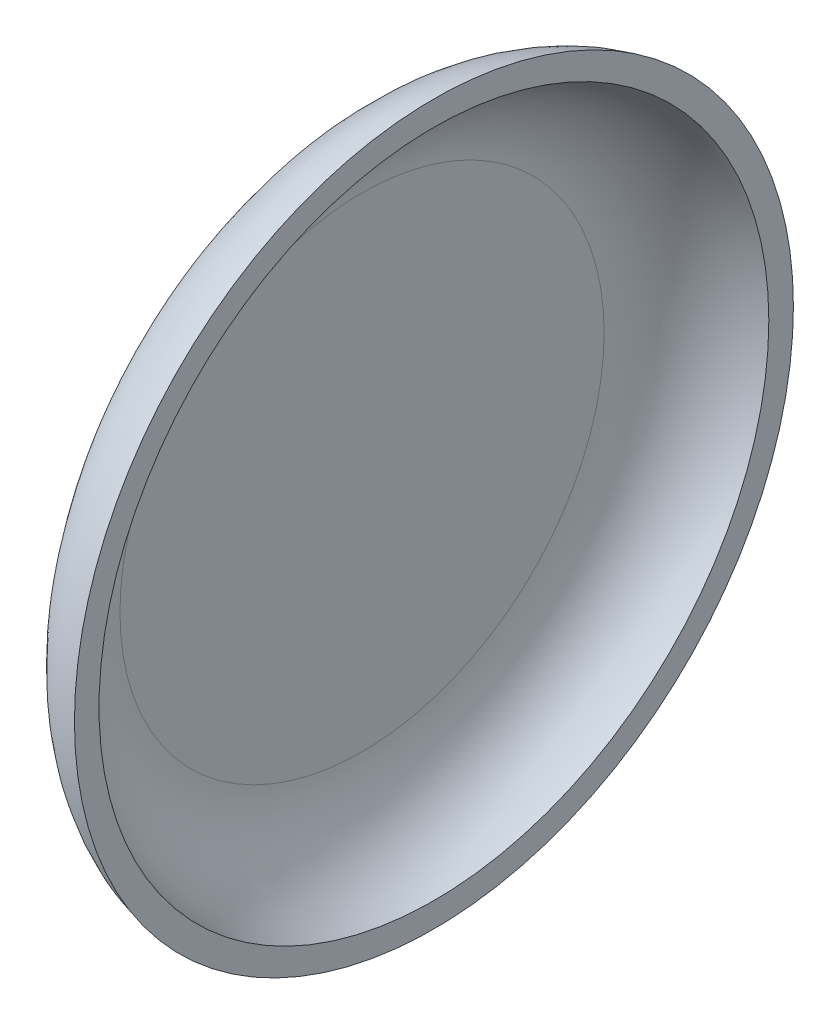
ISO-10303-21;
HEADER;
FILE_DESCRIPTION(('STEP AP214'),'2;1');
FILE_NAME('part.step','',(''),(''),'','','');
FILE_SCHEMA(('AUTOMOTIVE_DESIGN { 1 0 10303 214 1 1 1 1 }'));
ENDSEC;
DATA;
#1=APPLICATION_CONTEXT('core data for automotive mechanical design processes');
#2=APPLICATION_PROTOCOL_DEFINITION('international standard','automotive_design',2000,#1);
#3=PRODUCT_CONTEXT('',#1,'mechanical');
#4=PRODUCT('Part','Part','',(#3));
#5=PRODUCT_RELATED_PRODUCT_CATEGORY('part','',(#4));
#6=PRODUCT_DEFINITION_FORMATION('','',#4);
#7=PRODUCT_DEFINITION_CONTEXT('part definition',#1,'design');
#8=PRODUCT_DEFINITION('design','',#6,#7);
#9=PRODUCT_DEFINITION_SHAPE('','',#8);
#10=(LENGTH_UNIT() NAMED_UNIT(*) SI_UNIT(.MILLI.,.METRE.));
#11=(NAMED_UNIT(*) PLANE_ANGLE_UNIT() SI_UNIT($,.RADIAN.));
#12=(NAMED_UNIT(*) SI_UNIT($,.STERADIAN.) SOLID_ANGLE_UNIT());
#13=UNCERTAINTY_MEASURE_WITH_UNIT(LENGTH_MEASURE(1.E-05),#10,'distance_accuracy_value','');
#14=(GEOMETRIC_REPRESENTATION_CONTEXT(3) GLOBAL_UNCERTAINTY_ASSIGNED_CONTEXT((#13)) GLOBAL_UNIT_ASSIGNED_CONTEXT((#10,
#11,#12)) REPRESENTATION_CONTEXT('',''));
#15=CARTESIAN_POINT('',(0.,0.,0.));
#16=DIRECTION('',(0.,0.,1.));
#17=DIRECTION('',(1.,0.,0.));
#18=AXIS2_PLACEMENT_3D('',#15,#16,#17);
#19=CARTESIAN_POINT('',(-4.,0.,0.));
#20=DIRECTION('',(-1.,0.,0.));
#21=DIRECTION('',(0.,0.,1.));
#22=AXIS2_PLACEMENT_3D('',#19,#20,#21);
#23=PLANE('',#22);
#24=CARTESIAN_POINT('',(-4.,0.,0.));
#25=DIRECTION('',(1.,0.,0.));
#26=DIRECTION('',(0.,0.,-1.));
#27=AXIS2_PLACEMENT_3D('',#24,#25,#26);
#28=CIRCLE('',#27,10.1010205144336);
#29=CARTESIAN_POINT('',(-4.,0.,-10.1010205144336));
#30=VERTEX_POINT('',#29);
#31=EDGE_CURVE('E10',#30,#30,#28,.T.);
#32=ORIENTED_EDGE('',*,*,#31,.F.);
#33=EDGE_LOOP('',(#32));
#34=FACE_BOUND('',#33,.T.);
#35=ADVANCED_FACE('F37',(#34),#23,.T.);
#36=CARTESIAN_POINT('',(1.,0.,0.));
#37=DIRECTION('',(1.,0.,0.));
#38=DIRECTION('',(0.,0.,-1.));
#39=AXIS2_PLACEMENT_3D('',#36,#37,#38);
#40=TOROIDAL_SURFACE('',#39,10.1010205144336,5.);
#41=ORIENTED_EDGE('',*,*,#31,.T.);
#42=EDGE_LOOP('',(#41));
#43=FACE_BOUND('',#42,.T.);
#44=CARTESIAN_POINT('',(0.,0.,0.));
#45=DIRECTION('',(1.,0.,0.));
#46=DIRECTION('',(0.,0.,-1.));
#47=AXIS2_PLACEMENT_3D('',#44,#45,#46);
#48=CIRCLE('',#47,15.);
#49=CARTESIAN_POINT('',(0.,0.,-15.));
#50=VERTEX_POINT('',#49);
#51=EDGE_CURVE('E43',#50,#50,#48,.T.);
#52=ORIENTED_EDGE('',*,*,#51,.F.);
#53=EDGE_LOOP('',(#52));
#54=FACE_BOUND('',#53,.T.);
#55=ADVANCED_FACE('F69',(#43,#54),#40,.T.);
#56=CARTESIAN_POINT('',(0.,15.,0.));
#57=DIRECTION('',(1.,0.,0.));
#58=DIRECTION('',(0.,0.,-1.));
#59=AXIS2_PLACEMENT_3D('',#56,#57,#58);
#60=PLANE('',#59);
#61=ORIENTED_EDGE('',*,*,#51,.T.);
#62=EDGE_LOOP('',(#61));
#63=FACE_BOUND('',#62,.T.);
#64=CARTESIAN_POINT('',(0.,0.,0.));
#65=DIRECTION('',(1.,0.,0.));
#66=DIRECTION('',(0.,0.,-1.));
#67=AXIS2_PLACEMENT_3D('',#64,#65,#66);
#68=CIRCLE('',#67,13.9740038606411);
#69=CARTESIAN_POINT('',(0.,0.,-13.9740038606411));
#70=VERTEX_POINT('',#69);
#71=EDGE_CURVE('E47',#70,#70,#68,.T.);
#72=ORIENTED_EDGE('',*,*,#71,.F.);
#73=EDGE_LOOP('',(#72));
#74=FACE_BOUND('',#73,.T.);
#75=ADVANCED_FACE('F61',(#63,#74),#60,.T.);
#76=CARTESIAN_POINT('',(1.,0.,0.));
#77=DIRECTION('',(1.,0.,0.));
#78=DIRECTION('',(0.,0.,-1.));
#79=AXIS2_PLACEMENT_3D('',#76,#77,#78);
#80=TOROIDAL_SURFACE('',#79,10.1010205144336,4.);
#81=ORIENTED_EDGE('',*,*,#71,.T.);
#82=EDGE_LOOP('',(#81));
#83=FACE_BOUND('',#82,.T.);
#84=CARTESIAN_POINT('',(-3.,0.,0.));
#85=DIRECTION('',(1.,0.,0.));
#86=DIRECTION('',(0.,0.,-1.));
#87=AXIS2_PLACEMENT_3D('',#84,#85,#86);
#88=CIRCLE('',#87,10.1010205144336);
#89=CARTESIAN_POINT('',(-3.,0.,-10.1010205144336));
#90=VERTEX_POINT('',#89);
#91=EDGE_CURVE('E51',#90,#90,#88,.T.);
#92=ORIENTED_EDGE('',*,*,#91,.F.);
#93=EDGE_LOOP('',(#92));
#94=FACE_BOUND('',#93,.T.);
#95=ADVANCED_FACE('F59',(#83,#94),#80,.F.);
#96=CARTESIAN_POINT('',(-3.,0.,0.));
#97=DIRECTION('',(1.,0.,0.));
#98=DIRECTION('',(0.,0.,-1.));
#99=AXIS2_PLACEMENT_3D('',#96,#97,#98);
#100=PLANE('',#99);
#101=ORIENTED_EDGE('',*,*,#91,.T.);
#102=EDGE_LOOP('',(#101));
#103=FACE_BOUND('',#102,.T.);
#104=ADVANCED_FACE('F57',(#103),#100,.T.);
#105=CLOSED_SHELL('',(#35,#55,#75,#95,#104));
#106=MANIFOLD_SOLID_BREP('B2',#105);
#107=ADVANCED_BREP_SHAPE_REPRESENTATION('',(#18,#106),#14);
#108=SHAPE_DEFINITION_REPRESENTATION(#9,#107);
ENDSEC;
END-ISO-10303-21;
